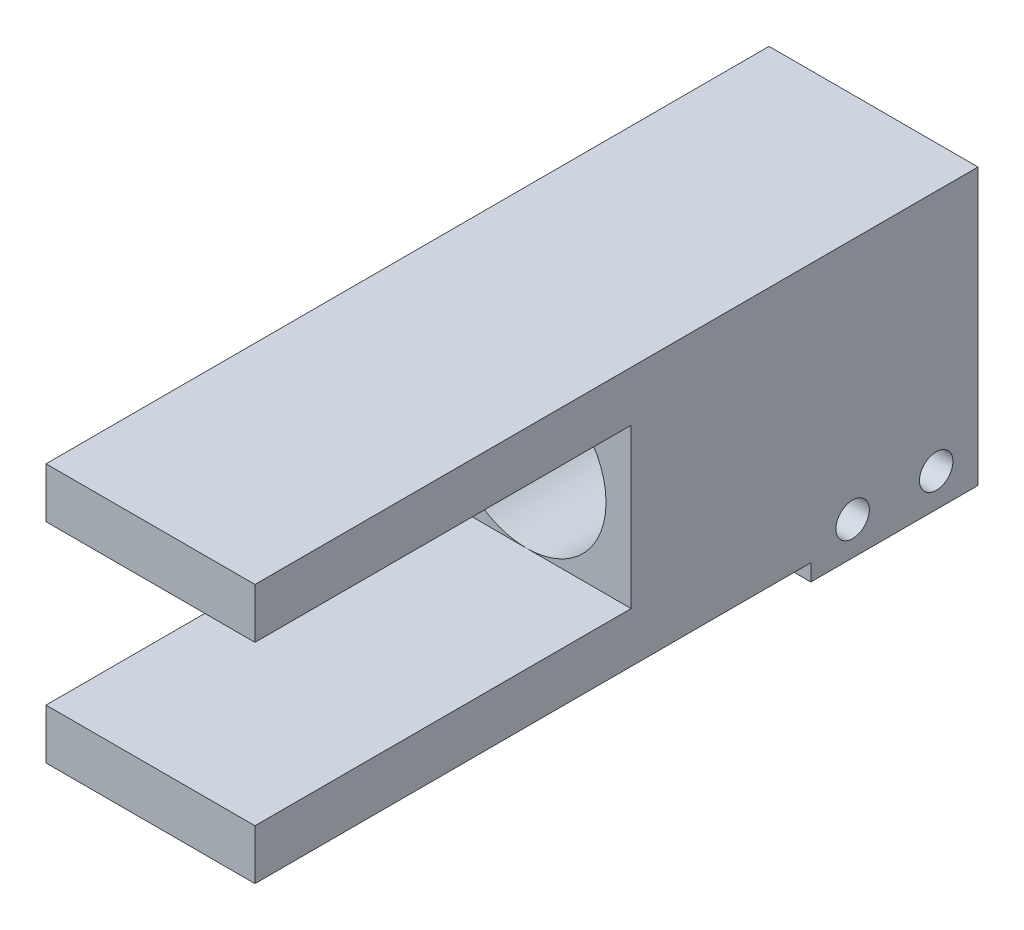
ISO-10303-21;
HEADER;
FILE_DESCRIPTION(('STEP AP214'),'2;1');
FILE_NAME('part.step','',(''),(''),'','','');
FILE_SCHEMA(('AUTOMOTIVE_DESIGN { 1 0 10303 214 1 1 1 1 }'));
ENDSEC;
DATA;
#1=APPLICATION_CONTEXT('core data for automotive mechanical design processes');
#2=APPLICATION_PROTOCOL_DEFINITION('international standard','automotive_design',2000,#1);
#3=PRODUCT_CONTEXT('',#1,'mechanical');
#4=PRODUCT('Part','Part','',(#3));
#5=PRODUCT_RELATED_PRODUCT_CATEGORY('part','',(#4));
#6=PRODUCT_DEFINITION_FORMATION('','',#4);
#7=PRODUCT_DEFINITION_CONTEXT('part definition',#1,'design');
#8=PRODUCT_DEFINITION('design','',#6,#7);
#9=PRODUCT_DEFINITION_SHAPE('','',#8);
#10=(LENGTH_UNIT() NAMED_UNIT(*) SI_UNIT(.MILLI.,.METRE.));
#11=(NAMED_UNIT(*) PLANE_ANGLE_UNIT() SI_UNIT($,.RADIAN.));
#12=(NAMED_UNIT(*) SI_UNIT($,.STERADIAN.) SOLID_ANGLE_UNIT());
#13=UNCERTAINTY_MEASURE_WITH_UNIT(LENGTH_MEASURE(1.E-05),#10,'distance_accuracy_value','');
#14=(GEOMETRIC_REPRESENTATION_CONTEXT(3) GLOBAL_UNCERTAINTY_ASSIGNED_CONTEXT((#13)) GLOBAL_UNIT_ASSIGNED_CONTEXT((#10,
#11,#12)) REPRESENTATION_CONTEXT('',''));
#15=CARTESIAN_POINT('',(0.,0.,0.));
#16=DIRECTION('',(0.,0.,1.));
#17=DIRECTION('',(1.,0.,0.));
#18=AXIS2_PLACEMENT_3D('',#15,#16,#17);
#19=CARTESIAN_POINT('',(12.5,-25.,41.5));
#20=DIRECTION('',(0.,0.,-1.));
#21=DIRECTION('',(-1.,0.,0.));
#22=AXIS2_PLACEMENT_3D('',#19,#20,#21);
#23=PLANE('',#22);
#24=DIRECTION('',(-1.,0.,0.));
#25=VECTOR('',#24,1.);
#26=CARTESIAN_POINT('',(12.5,-5.99999999999999,41.5));
#27=LINE('',#26,#25);
#28=CARTESIAN_POINT('',(12.5,-5.99999999999999,41.5));
#29=VERTEX_POINT('',#28);
#30=CARTESIAN_POINT('',(0.,-5.99999999999999,41.5));
#31=VERTEX_POINT('',#30);
#32=EDGE_CURVE('E188',#29,#31,#27,.T.);
#33=ORIENTED_EDGE('',*,*,#32,.T.);
#34=CARTESIAN_POINT('',(0.,-15.5,41.5));
#35=DIRECTION('',(0.,0.,1.));
#36=DIRECTION('',(1.,0.,0.));
#37=AXIS2_PLACEMENT_3D('',#34,#35,#36);
#38=CIRCLE('',#37,9.5);
#39=CARTESIAN_POINT('',(0.,-25.,41.5));
#40=VERTEX_POINT('',#39);
#41=EDGE_CURVE('E47',#40,#31,#38,.T.);
#42=ORIENTED_EDGE('',*,*,#41,.F.);
#43=DIRECTION('',(-1.,0.,0.));
#44=VECTOR('',#43,1.);
#45=CARTESIAN_POINT('',(12.5,-25.,41.5));
#46=LINE('',#45,#44);
#47=CARTESIAN_POINT('',(12.5,-25.,41.5));
#48=VERTEX_POINT('',#47);
#49=EDGE_CURVE('E184',#48,#40,#46,.T.);
#50=ORIENTED_EDGE('',*,*,#49,.F.);
#51=DIRECTION('',(0.,-1.,0.));
#52=VECTOR('',#51,1.);
#53=CARTESIAN_POINT('',(12.5,-25.,41.5));
#54=LINE('',#53,#52);
#55=EDGE_CURVE('E211',#29,#48,#54,.T.);
#56=ORIENTED_EDGE('',*,*,#55,.F.);
#57=EDGE_LOOP('',(#33,#42,#50,#56));
#58=FACE_BOUND('',#57,.T.);
#59=ADVANCED_FACE('F33',(#58),#23,.F.);
#60=CARTESIAN_POINT('',(12.5,0.,86.5));
#61=DIRECTION('',(0.,-1.,0.));
#62=DIRECTION('',(0.,0.,-1.));
#63=AXIS2_PLACEMENT_3D('',#60,#61,#62);
#64=PLANE('',#63);
#65=DIRECTION('',(0.,0.,1.));
#66=VECTOR('',#65,1.);
#67=CARTESIAN_POINT('',(-12.5,0.,86.5));
#68=LINE('',#67,#66);
#69=CARTESIAN_POINT('',(-12.5,0.,0.));
#70=VERTEX_POINT('',#69);
#71=CARTESIAN_POINT('',(-12.5,0.,86.5));
#72=VERTEX_POINT('',#71);
#73=EDGE_CURVE('E151',#70,#72,#68,.T.);
#74=ORIENTED_EDGE('',*,*,#73,.T.);
#75=DIRECTION('',(-1.,0.,0.));
#76=VECTOR('',#75,1.);
#77=CARTESIAN_POINT('',(12.5,0.,86.5));
#78=LINE('',#77,#76);
#79=CARTESIAN_POINT('',(12.5,0.,86.5));
#80=VERTEX_POINT('',#79);
#81=EDGE_CURVE('E11',#80,#72,#78,.T.);
#82=ORIENTED_EDGE('',*,*,#81,.F.);
#83=DIRECTION('',(0.,0.,1.));
#84=VECTOR('',#83,1.);
#85=CARTESIAN_POINT('',(12.5,0.,86.5));
#86=LINE('',#85,#84);
#87=CARTESIAN_POINT('',(12.5,0.,0.));
#88=VERTEX_POINT('',#87);
#89=EDGE_CURVE('E173',#88,#80,#86,.T.);
#90=ORIENTED_EDGE('',*,*,#89,.F.);
#91=DIRECTION('',(-1.,0.,0.));
#92=VECTOR('',#91,1.);
#93=CARTESIAN_POINT('',(12.5,0.,0.));
#94=LINE('',#93,#92);
#95=EDGE_CURVE('E147',#88,#70,#94,.T.);
#96=ORIENTED_EDGE('',*,*,#95,.T.);
#97=EDGE_LOOP('',(#74,#82,#90,#96));
#98=FACE_BOUND('',#97,.T.);
#99=ADVANCED_FACE('F35',(#98),#64,.F.);
#100=CARTESIAN_POINT('',(12.5,-6.,86.5));
#101=DIRECTION('',(0.,0.,-1.));
#102=DIRECTION('',(-1.,0.,0.));
#103=AXIS2_PLACEMENT_3D('',#100,#101,#102);
#104=PLANE('',#103);
#105=DIRECTION('',(0.,-1.,0.));
#106=VECTOR('',#105,1.);
#107=CARTESIAN_POINT('',(-12.5,-6.,86.5));
#108=LINE('',#107,#106);
#109=CARTESIAN_POINT('',(-12.5,-6.,86.5));
#110=VERTEX_POINT('',#109);
#111=EDGE_CURVE('E154',#72,#110,#108,.T.);
#112=ORIENTED_EDGE('',*,*,#111,.T.);
#113=DIRECTION('',(-1.,0.,0.));
#114=VECTOR('',#113,1.);
#115=CARTESIAN_POINT('',(12.5,-6.,86.5));
#116=LINE('',#115,#114);
#117=CARTESIAN_POINT('',(12.5,-6.,86.5));
#118=VERTEX_POINT('',#117);
#119=EDGE_CURVE('E41',#118,#110,#116,.T.);
#120=ORIENTED_EDGE('',*,*,#119,.F.);
#121=DIRECTION('',(0.,-1.,0.));
#122=VECTOR('',#121,1.);
#123=CARTESIAN_POINT('',(12.5,-6.,86.5));
#124=LINE('',#123,#122);
#125=EDGE_CURVE('E103',#80,#118,#124,.T.);
#126=ORIENTED_EDGE('',*,*,#125,.F.);
#127=ORIENTED_EDGE('',*,*,#81,.T.);
#128=EDGE_LOOP('',(#112,#120,#126,#127));
#129=FACE_BOUND('',#128,.T.);
#130=ADVANCED_FACE('F283',(#129),#104,.F.);
#131=CARTESIAN_POINT('',(12.5,-5.99999999999999,41.5));
#132=DIRECTION('',(0.,1.,0.));
#133=DIRECTION('',(0.,0.,1.));
#134=AXIS2_PLACEMENT_3D('',#131,#132,#133);
#135=PLANE('',#134);
#136=DIRECTION('',(0.,0.,-1.));
#137=VECTOR('',#136,1.);
#138=CARTESIAN_POINT('',(-12.5,-5.99999999999999,41.5));
#139=LINE('',#138,#137);
#140=CARTESIAN_POINT('',(-12.5,-5.99999999999999,41.5));
#141=VERTEX_POINT('',#140);
#142=EDGE_CURVE('E157',#110,#141,#139,.T.);
#143=ORIENTED_EDGE('',*,*,#142,.T.);
#144=EDGE_CURVE('E187',#31,#141,#27,.T.);
#145=ORIENTED_EDGE('',*,*,#144,.F.);
#146=ORIENTED_EDGE('',*,*,#32,.F.);
#147=DIRECTION('',(0.,0.,-1.));
#148=VECTOR('',#147,1.);
#149=CARTESIAN_POINT('',(12.5,-5.99999999999999,41.5));
#150=LINE('',#149,#148);
#151=EDGE_CURVE('E198',#118,#29,#150,.T.);
#152=ORIENTED_EDGE('',*,*,#151,.F.);
#153=ORIENTED_EDGE('',*,*,#119,.T.);
#154=EDGE_LOOP('',(#143,#145,#146,#152,#153));
#155=FACE_BOUND('',#154,.T.);
#156=ADVANCED_FACE('F194',(#155),#135,.F.);
#157=CARTESIAN_POINT('',(-12.5,-25.,41.5));
#158=VERTEX_POINT('',#157);
#159=EDGE_CURVE('E183',#40,#158,#46,.T.);
#160=ORIENTED_EDGE('',*,*,#159,.F.);
#161=EDGE_CURVE('E207',#31,#40,#38,.T.);
#162=ORIENTED_EDGE('',*,*,#161,.F.);
#163=ORIENTED_EDGE('',*,*,#144,.T.);
#164=DIRECTION('',(0.,-1.,0.));
#165=VECTOR('',#164,1.);
#166=CARTESIAN_POINT('',(-12.5,-25.,41.5));
#167=LINE('',#166,#165);
#168=EDGE_CURVE('E160',#141,#158,#167,.T.);
#169=ORIENTED_EDGE('',*,*,#168,.T.);
#170=EDGE_LOOP('',(#160,#162,#163,#169));
#171=FACE_BOUND('',#170,.T.);
#172=ADVANCED_FACE('F206',(#171),#23,.F.);
#173=CARTESIAN_POINT('',(12.5,-25.,86.5));
#174=DIRECTION('',(0.,-1.,0.));
#175=DIRECTION('',(0.,0.,-1.));
#176=AXIS2_PLACEMENT_3D('',#173,#174,#175);
#177=PLANE('',#176);
#178=DIRECTION('',(0.,0.,1.));
#179=VECTOR('',#178,1.);
#180=CARTESIAN_POINT('',(-12.5,-25.,86.5));
#181=LINE('',#180,#179);
#182=CARTESIAN_POINT('',(-12.5,-25.,86.5));
#183=VERTEX_POINT('',#182);
#184=EDGE_CURVE('E163',#158,#183,#181,.T.);
#185=ORIENTED_EDGE('',*,*,#184,.T.);
#186=DIRECTION('',(-1.,0.,0.));
#187=VECTOR('',#186,1.);
#188=CARTESIAN_POINT('',(12.5,-25.,86.5));
#189=LINE('',#188,#187);
#190=CARTESIAN_POINT('',(12.5,-25.,86.5));
#191=VERTEX_POINT('',#190);
#192=EDGE_CURVE('E180',#191,#183,#189,.T.);
#193=ORIENTED_EDGE('',*,*,#192,.F.);
#194=DIRECTION('',(0.,0.,1.));
#195=VECTOR('',#194,1.);
#196=CARTESIAN_POINT('',(12.5,-25.,86.5));
#197=LINE('',#196,#195);
#198=EDGE_CURVE('E213',#48,#191,#197,.T.);
#199=ORIENTED_EDGE('',*,*,#198,.F.);
#200=ORIENTED_EDGE('',*,*,#49,.T.);
#201=ORIENTED_EDGE('',*,*,#159,.T.);
#202=EDGE_LOOP('',(#185,#193,#199,#200,#201));
#203=FACE_BOUND('',#202,.T.);
#204=ADVANCED_FACE('F287',(#203),#177,.F.);
#205=CARTESIAN_POINT('',(12.5,-31.,86.5));
#206=DIRECTION('',(0.,0.,-1.));
#207=DIRECTION('',(-1.,0.,0.));
#208=AXIS2_PLACEMENT_3D('',#205,#206,#207);
#209=PLANE('',#208);
#210=DIRECTION('',(0.,-1.,0.));
#211=VECTOR('',#210,1.);
#212=CARTESIAN_POINT('',(-12.5,-31.,86.5));
#213=LINE('',#212,#211);
#214=CARTESIAN_POINT('',(-12.5,-31.,86.5));
#215=VERTEX_POINT('',#214);
#216=EDGE_CURVE('E165',#183,#215,#213,.T.);
#217=ORIENTED_EDGE('',*,*,#216,.T.);
#218=DIRECTION('',(-1.,0.,0.));
#219=VECTOR('',#218,1.);
#220=CARTESIAN_POINT('',(12.5,-31.,86.5));
#221=LINE('',#220,#219);
#222=CARTESIAN_POINT('',(12.5,-31.,86.5));
#223=VERTEX_POINT('',#222);
#224=EDGE_CURVE('E177',#223,#215,#221,.T.);
#225=ORIENTED_EDGE('',*,*,#224,.F.);
#226=DIRECTION('',(0.,-1.,0.));
#227=VECTOR('',#226,1.);
#228=CARTESIAN_POINT('',(12.5,-31.,86.5));
#229=LINE('',#228,#227);
#230=EDGE_CURVE('E215',#191,#223,#229,.T.);
#231=ORIENTED_EDGE('',*,*,#230,.F.);
#232=ORIENTED_EDGE('',*,*,#192,.T.);
#233=EDGE_LOOP('',(#217,#225,#231,#232));
#234=FACE_BOUND('',#233,.T.);
#235=ADVANCED_FACE('F224',(#234),#209,.F.);
#236=CARTESIAN_POINT('',(12.5,-31.,20.));
#237=DIRECTION('',(0.,1.,0.));
#238=DIRECTION('',(0.,0.,1.));
#239=AXIS2_PLACEMENT_3D('',#236,#237,#238);
#240=PLANE('',#239);
#241=DIRECTION('',(0.,0.,-1.));
#242=VECTOR('',#241,1.);
#243=CARTESIAN_POINT('',(-12.5,-31.,20.));
#244=LINE('',#243,#242);
#245=CARTESIAN_POINT('',(-12.5,-31.,20.));
#246=VERTEX_POINT('',#245);
#247=EDGE_CURVE('E167',#215,#246,#244,.T.);
#248=ORIENTED_EDGE('',*,*,#247,.T.);
#249=DIRECTION('',(-1.,0.,0.));
#250=VECTOR('',#249,1.);
#251=CARTESIAN_POINT('',(12.5,-31.,20.));
#252=LINE('',#251,#250);
#253=CARTESIAN_POINT('',(12.5,-31.,20.));
#254=VERTEX_POINT('',#253);
#255=EDGE_CURVE('E142',#254,#246,#252,.T.);
#256=ORIENTED_EDGE('',*,*,#255,.F.);
#257=DIRECTION('',(0.,0.,-1.));
#258=VECTOR('',#257,1.);
#259=CARTESIAN_POINT('',(12.5,-31.,20.));
#260=LINE('',#259,#258);
#261=EDGE_CURVE('E130',#223,#254,#260,.T.);
#262=ORIENTED_EDGE('',*,*,#261,.F.);
#263=ORIENTED_EDGE('',*,*,#224,.T.);
#264=EDGE_LOOP('',(#248,#256,#262,#263));
#265=FACE_BOUND('',#264,.T.);
#266=ADVANCED_FACE('F227',(#265),#240,.F.);
#267=CARTESIAN_POINT('',(12.5,-33.,20.));
#268=DIRECTION('',(0.,0.,-1.));
#269=DIRECTION('',(-1.,0.,0.));
#270=AXIS2_PLACEMENT_3D('',#267,#268,#269);
#271=PLANE('',#270);
#272=DIRECTION('',(0.,-1.,0.));
#273=VECTOR('',#272,1.);
#274=CARTESIAN_POINT('',(-12.5,-33.,20.));
#275=LINE('',#274,#273);
#276=CARTESIAN_POINT('',(-12.5,-33.,20.));
#277=VERTEX_POINT('',#276);
#278=EDGE_CURVE('E139',#246,#277,#275,.T.);
#279=ORIENTED_EDGE('',*,*,#278,.T.);
#280=DIRECTION('',(-1.,0.,0.));
#281=VECTOR('',#280,1.);
#282=CARTESIAN_POINT('',(12.5,-33.,20.));
#283=LINE('',#282,#281);
#284=CARTESIAN_POINT('',(12.5,-33.,20.));
#285=VERTEX_POINT('',#284);
#286=EDGE_CURVE('E136',#285,#277,#283,.T.);
#287=ORIENTED_EDGE('',*,*,#286,.F.);
#288=DIRECTION('',(0.,-1.,0.));
#289=VECTOR('',#288,1.);
#290=CARTESIAN_POINT('',(12.5,-33.,20.));
#291=LINE('',#290,#289);
#292=EDGE_CURVE('E123',#254,#285,#291,.T.);
#293=ORIENTED_EDGE('',*,*,#292,.F.);
#294=ORIENTED_EDGE('',*,*,#255,.T.);
#295=EDGE_LOOP('',(#279,#287,#293,#294));
#296=FACE_BOUND('',#295,.T.);
#297=ADVANCED_FACE('F137',(#296),#271,.F.);
#298=CARTESIAN_POINT('',(12.5,-33.,0.));
#299=DIRECTION('',(0.,1.,0.));
#300=DIRECTION('',(0.,0.,1.));
#301=AXIS2_PLACEMENT_3D('',#298,#299,#300);
#302=PLANE('',#301);
#303=DIRECTION('',(0.,0.,-1.));
#304=VECTOR('',#303,1.);
#305=CARTESIAN_POINT('',(-12.5,-33.,0.));
#306=LINE('',#305,#304);
#307=CARTESIAN_POINT('',(-12.5,-33.,0.));
#308=VERTEX_POINT('',#307);
#309=EDGE_CURVE('E170',#277,#308,#306,.T.);
#310=ORIENTED_EDGE('',*,*,#309,.T.);
#311=DIRECTION('',(-1.,0.,0.));
#312=VECTOR('',#311,1.);
#313=CARTESIAN_POINT('',(12.5,-33.,0.));
#314=LINE('',#313,#312);
#315=CARTESIAN_POINT('',(12.5,-33.,0.));
#316=VERTEX_POINT('',#315);
#317=EDGE_CURVE('E143',#316,#308,#314,.T.);
#318=ORIENTED_EDGE('',*,*,#317,.F.);
#319=DIRECTION('',(0.,0.,-1.));
#320=VECTOR('',#319,1.);
#321=CARTESIAN_POINT('',(12.5,-33.,0.));
#322=LINE('',#321,#320);
#323=EDGE_CURVE('E127',#285,#316,#322,.T.);
#324=ORIENTED_EDGE('',*,*,#323,.F.);
#325=ORIENTED_EDGE('',*,*,#286,.T.);
#326=EDGE_LOOP('',(#310,#318,#324,#325));
#327=FACE_BOUND('',#326,.T.);
#328=ADVANCED_FACE('F145',(#327),#302,.F.);
#329=CARTESIAN_POINT('',(12.5,0.,0.));
#330=DIRECTION('',(0.,0.,1.));
#331=DIRECTION('',(0.,-1.,0.));
#332=AXIS2_PLACEMENT_3D('',#329,#330,#331);
#333=PLANE('',#332);
#334=CARTESIAN_POINT('',(0.,-15.5,0.));
#335=DIRECTION('',(0.,0.,1.));
#336=DIRECTION('',(0.,-1.,0.));
#337=AXIS2_PLACEMENT_3D('',#334,#335,#336);
#338=CIRCLE('',#337,7.);
#339=CARTESIAN_POINT('',(0.,-22.5,0.));
#340=VERTEX_POINT('',#339);
#341=EDGE_CURVE('E237',#340,#340,#338,.F.);
#342=ORIENTED_EDGE('',*,*,#341,.F.);
#343=EDGE_LOOP('',(#342));
#344=FACE_BOUND('',#343,.T.);
#345=DIRECTION('',(0.,1.,0.));
#346=VECTOR('',#345,1.);
#347=CARTESIAN_POINT('',(-12.5,0.,0.));
#348=LINE('',#347,#346);
#349=EDGE_CURVE('E95',#308,#70,#348,.T.);
#350=ORIENTED_EDGE('',*,*,#349,.T.);
#351=ORIENTED_EDGE('',*,*,#95,.F.);
#352=DIRECTION('',(0.,1.,0.));
#353=VECTOR('',#352,1.);
#354=CARTESIAN_POINT('',(12.5,0.,0.));
#355=LINE('',#354,#353);
#356=EDGE_CURVE('E56',#316,#88,#355,.T.);
#357=ORIENTED_EDGE('',*,*,#356,.F.);
#358=ORIENTED_EDGE('',*,*,#317,.T.);
#359=EDGE_LOOP('',(#350,#351,#357,#358));
#360=FACE_BOUND('',#359,.T.);
#361=ADVANCED_FACE('F228',(#344,#360),#333,.F.);
#362=CARTESIAN_POINT('',(12.5,0.,0.));
#363=DIRECTION('',(-1.,0.,0.));
#364=DIRECTION('',(0.,0.,1.));
#365=AXIS2_PLACEMENT_3D('',#362,#363,#364);
#366=PLANE('',#365);
#367=CARTESIAN_POINT('',(12.5,-29.,15.));
#368=DIRECTION('',(1.,0.,0.));
#369=DIRECTION('',(0.,0.,-1.));
#370=AXIS2_PLACEMENT_3D('',#367,#368,#369);
#371=CIRCLE('',#370,2.);
#372=CARTESIAN_POINT('',(12.5,-29.,13.));
#373=VERTEX_POINT('',#372);
#374=EDGE_CURVE('E243',#373,#373,#371,.T.);
#375=ORIENTED_EDGE('',*,*,#374,.F.);
#376=EDGE_LOOP('',(#375));
#377=FACE_BOUND('',#376,.T.);
#378=CARTESIAN_POINT('',(12.5,-29.,5.));
#379=DIRECTION('',(1.,0.,0.));
#380=DIRECTION('',(0.,0.,-1.));
#381=AXIS2_PLACEMENT_3D('',#378,#379,#380);
#382=CIRCLE('',#381,2.);
#383=CARTESIAN_POINT('',(12.5,-29.,2.99999999999999));
#384=VERTEX_POINT('',#383);
#385=EDGE_CURVE('E244',#384,#384,#382,.T.);
#386=ORIENTED_EDGE('',*,*,#385,.F.);
#387=EDGE_LOOP('',(#386));
#388=FACE_BOUND('',#387,.T.);
#389=ORIENTED_EDGE('',*,*,#89,.T.);
#390=ORIENTED_EDGE('',*,*,#125,.T.);
#391=ORIENTED_EDGE('',*,*,#151,.T.);
#392=ORIENTED_EDGE('',*,*,#55,.T.);
#393=ORIENTED_EDGE('',*,*,#198,.T.);
#394=ORIENTED_EDGE('',*,*,#230,.T.);
#395=ORIENTED_EDGE('',*,*,#261,.T.);
#396=ORIENTED_EDGE('',*,*,#292,.T.);
#397=ORIENTED_EDGE('',*,*,#323,.T.);
#398=ORIENTED_EDGE('',*,*,#356,.T.);
#399=EDGE_LOOP('',(#389,#390,#391,#392,#393,#394,#395,#396,#397,#398));
#400=FACE_BOUND('',#399,.T.);
#401=ADVANCED_FACE('F125',(#377,#388,#400),#366,.F.);
#402=CARTESIAN_POINT('',(-12.5,0.,0.));
#403=DIRECTION('',(-1.,0.,0.));
#404=DIRECTION('',(0.,0.,1.));
#405=AXIS2_PLACEMENT_3D('',#402,#403,#404);
#406=PLANE('',#405);
#407=CARTESIAN_POINT('',(-12.5,-29.,15.));
#408=DIRECTION('',(-1.,0.,0.));
#409=DIRECTION('',(0.,0.,1.));
#410=AXIS2_PLACEMENT_3D('',#407,#408,#409);
#411=CIRCLE('',#410,2.);
#412=CARTESIAN_POINT('',(-12.5,-29.,17.));
#413=VERTEX_POINT('',#412);
#414=EDGE_CURVE('E250',#413,#413,#411,.F.);
#415=ORIENTED_EDGE('',*,*,#414,.T.);
#416=EDGE_LOOP('',(#415));
#417=FACE_BOUND('',#416,.T.);
#418=CARTESIAN_POINT('',(-12.5,-29.,5.));
#419=DIRECTION('',(-1.,0.,0.));
#420=DIRECTION('',(0.,0.,1.));
#421=AXIS2_PLACEMENT_3D('',#418,#419,#420);
#422=CIRCLE('',#421,2.);
#423=CARTESIAN_POINT('',(-12.5,-29.,7.));
#424=VERTEX_POINT('',#423);
#425=EDGE_CURVE('E247',#424,#424,#422,.F.);
#426=ORIENTED_EDGE('',*,*,#425,.T.);
#427=EDGE_LOOP('',(#426));
#428=FACE_BOUND('',#427,.T.);
#429=ORIENTED_EDGE('',*,*,#73,.F.);
#430=ORIENTED_EDGE('',*,*,#349,.F.);
#431=ORIENTED_EDGE('',*,*,#309,.F.);
#432=ORIENTED_EDGE('',*,*,#278,.F.);
#433=ORIENTED_EDGE('',*,*,#247,.F.);
#434=ORIENTED_EDGE('',*,*,#216,.F.);
#435=ORIENTED_EDGE('',*,*,#184,.F.);
#436=ORIENTED_EDGE('',*,*,#168,.F.);
#437=ORIENTED_EDGE('',*,*,#142,.F.);
#438=ORIENTED_EDGE('',*,*,#111,.F.);
#439=EDGE_LOOP('',(#429,#430,#431,#432,#433,#434,#435,#436,#437,#438));
#440=FACE_BOUND('',#439,.T.);
#441=ADVANCED_FACE('F201',(#417,#428,#440),#406,.T.);
#442=CARTESIAN_POINT('',(0.,-15.5,17.));
#443=DIRECTION('',(0.,0.,1.));
#444=DIRECTION('',(1.,0.,0.));
#445=AXIS2_PLACEMENT_3D('',#442,#443,#444);
#446=CYLINDRICAL_SURFACE('',#445,9.5);
#447=CARTESIAN_POINT('',(0.,-15.5,17.));
#448=DIRECTION('',(0.,0.,1.));
#449=DIRECTION('',(1.,0.,0.));
#450=AXIS2_PLACEMENT_3D('',#447,#448,#449);
#451=CIRCLE('',#450,9.5);
#452=CARTESIAN_POINT('',(9.5,-15.5,17.));
#453=VERTEX_POINT('',#452);
#454=EDGE_CURVE('E155',#453,#453,#451,.T.);
#455=ORIENTED_EDGE('',*,*,#454,.F.);
#456=EDGE_LOOP('',(#455));
#457=FACE_BOUND('',#456,.T.);
#458=ORIENTED_EDGE('',*,*,#161,.T.);
#459=ORIENTED_EDGE('',*,*,#41,.T.);
#460=EDGE_LOOP('',(#458,#459));
#461=FACE_BOUND('',#460,.T.);
#462=ADVANCED_FACE('F371',(#457,#461),#446,.F.);
#463=CARTESIAN_POINT('',(0.,-15.5,17.));
#464=DIRECTION('',(0.,0.,1.));
#465=DIRECTION('',(1.,0.,0.));
#466=AXIS2_PLACEMENT_3D('',#463,#464,#465);
#467=PLANE('',#466);
#468=CARTESIAN_POINT('',(0.,-15.5,17.));
#469=DIRECTION('',(0.,0.,1.));
#470=DIRECTION('',(1.,0.,0.));
#471=AXIS2_PLACEMENT_3D('',#468,#469,#470);
#472=CIRCLE('',#471,7.);
#473=CARTESIAN_POINT('',(7.,-15.5,17.));
#474=VERTEX_POINT('',#473);
#475=EDGE_CURVE('E240',#474,#474,#472,.T.);
#476=ORIENTED_EDGE('',*,*,#475,.F.);
#477=EDGE_LOOP('',(#476));
#478=FACE_BOUND('',#477,.T.);
#479=ORIENTED_EDGE('',*,*,#454,.T.);
#480=EDGE_LOOP('',(#479));
#481=FACE_BOUND('',#480,.T.);
#482=ADVANCED_FACE('F274',(#478,#481),#467,.T.);
#483=CARTESIAN_POINT('',(0.,-15.5,-0.00100000000000447));
#484=DIRECTION('',(0.,0.,1.));
#485=DIRECTION('',(1.,0.,0.));
#486=AXIS2_PLACEMENT_3D('',#483,#484,#485);
#487=CYLINDRICAL_SURFACE('',#486,7.);
#488=ORIENTED_EDGE('',*,*,#475,.T.);
#489=EDGE_LOOP('',(#488));
#490=FACE_BOUND('',#489,.T.);
#491=ORIENTED_EDGE('',*,*,#341,.T.);
#492=EDGE_LOOP('',(#491));
#493=FACE_BOUND('',#492,.T.);
#494=ADVANCED_FACE('F265',(#490,#493),#487,.F.);
#495=CARTESIAN_POINT('',(-12.501,-29.,5.));
#496=DIRECTION('',(1.,0.,0.));
#497=DIRECTION('',(0.,0.,-1.));
#498=AXIS2_PLACEMENT_3D('',#495,#496,#497);
#499=CYLINDRICAL_SURFACE('',#498,2.);
#500=ORIENTED_EDGE('',*,*,#425,.F.);
#501=EDGE_LOOP('',(#500));
#502=FACE_BOUND('',#501,.T.);
#503=ORIENTED_EDGE('',*,*,#385,.T.);
#504=EDGE_LOOP('',(#503));
#505=FACE_BOUND('',#504,.T.);
#506=ADVANCED_FACE('F263',(#502,#505),#499,.F.);
#507=CARTESIAN_POINT('',(-12.501,-29.,15.));
#508=DIRECTION('',(1.,0.,0.));
#509=DIRECTION('',(0.,0.,-1.));
#510=AXIS2_PLACEMENT_3D('',#507,#508,#509);
#511=CYLINDRICAL_SURFACE('',#510,2.);
#512=ORIENTED_EDGE('',*,*,#414,.F.);
#513=EDGE_LOOP('',(#512));
#514=FACE_BOUND('',#513,.T.);
#515=ORIENTED_EDGE('',*,*,#374,.T.);
#516=EDGE_LOOP('',(#515));
#517=FACE_BOUND('',#516,.T.);
#518=ADVANCED_FACE('F256',(#514,#517),#511,.F.);
#519=CLOSED_SHELL('',(#59,#99,#130,#156,#172,#204,#235,#266,#297,#328,#361,#401,#441,#462,#482,
#494,#506,#518));
#520=MANIFOLD_SOLID_BREP('B2',#519);
#521=ADVANCED_BREP_SHAPE_REPRESENTATION('',(#18,#520),#14);
#522=SHAPE_DEFINITION_REPRESENTATION(#9,#521);
ENDSEC;
END-ISO-10303-21;
